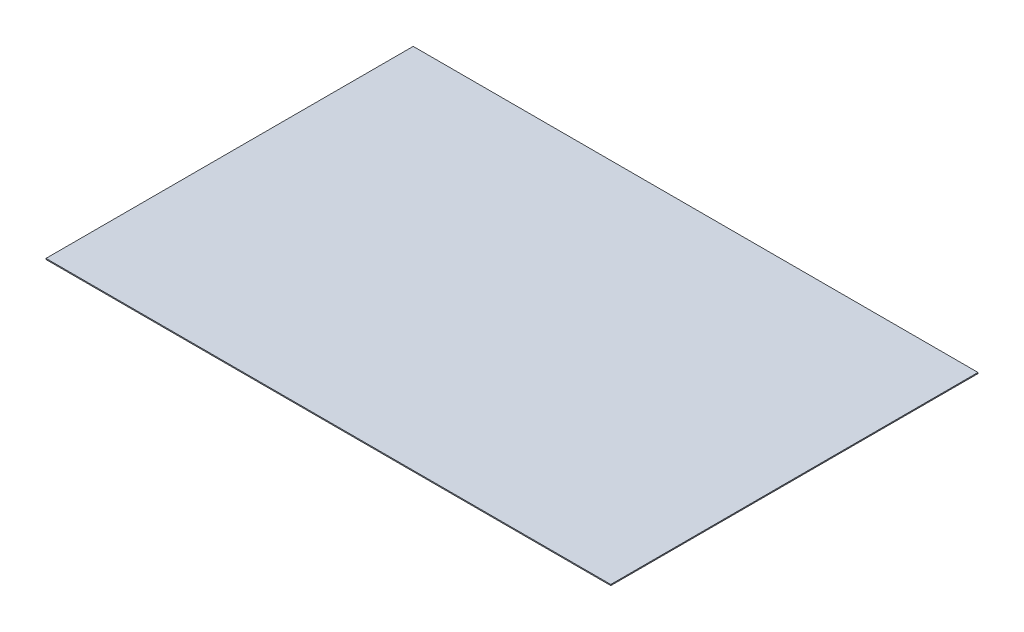
ISO-10303-21;
HEADER;
FILE_DESCRIPTION(('STEP AP214'),'2;1');
FILE_NAME('part.step','',(''),(''),'','','');
FILE_SCHEMA(('AUTOMOTIVE_DESIGN { 1 0 10303 214 1 1 1 1 }'));
ENDSEC;
DATA;
#1=APPLICATION_CONTEXT('core data for automotive mechanical design processes');
#2=APPLICATION_PROTOCOL_DEFINITION('international standard','automotive_design',2000,#1);
#3=PRODUCT_CONTEXT('',#1,'mechanical');
#4=PRODUCT('Part','Part','',(#3));
#5=PRODUCT_RELATED_PRODUCT_CATEGORY('part','',(#4));
#6=PRODUCT_DEFINITION_FORMATION('','',#4);
#7=PRODUCT_DEFINITION_CONTEXT('part definition',#1,'design');
#8=PRODUCT_DEFINITION('design','',#6,#7);
#9=PRODUCT_DEFINITION_SHAPE('','',#8);
#10=(LENGTH_UNIT() NAMED_UNIT(*) SI_UNIT(.MILLI.,.METRE.));
#11=(NAMED_UNIT(*) PLANE_ANGLE_UNIT() SI_UNIT($,.RADIAN.));
#12=(NAMED_UNIT(*) SI_UNIT($,.STERADIAN.) SOLID_ANGLE_UNIT());
#13=UNCERTAINTY_MEASURE_WITH_UNIT(LENGTH_MEASURE(1.E-05),#10,'distance_accuracy_value','');
#14=(GEOMETRIC_REPRESENTATION_CONTEXT(3) GLOBAL_UNCERTAINTY_ASSIGNED_CONTEXT((#13)) GLOBAL_UNIT_ASSIGNED_CONTEXT((#10,
#11,#12)) REPRESENTATION_CONTEXT('',''));
#15=CARTESIAN_POINT('',(0.,0.,0.));
#16=DIRECTION('',(0.,0.,1.));
#17=DIRECTION('',(1.,0.,0.));
#18=AXIS2_PLACEMENT_3D('',#15,#16,#17);
#19=CARTESIAN_POINT('',(468.689888187922,2.,204.733904573833));
#20=DIRECTION('',(-1.,0.,0.));
#21=DIRECTION('',(0.,0.,1.));
#22=AXIS2_PLACEMENT_3D('',#19,#20,#21);
#23=PLANE('',#22);
#24=DIRECTION('',(0.,0.,-1.));
#25=VECTOR('',#24,1.);
#26=CARTESIAN_POINT('',(468.689888187922,0.,204.733904573833));
#27=LINE('',#26,#25);
#28=CARTESIAN_POINT('',(468.689888187922,0.,204.733904573833));
#29=VERTEX_POINT('',#28);
#30=CARTESIAN_POINT('',(468.689888187922,0.,-503.266095426167));
#31=VERTEX_POINT('',#30);
#32=EDGE_CURVE('E96',#29,#31,#27,.T.);
#33=ORIENTED_EDGE('',*,*,#32,.T.);
#34=DIRECTION('',(0.,-1.,0.));
#35=VECTOR('',#34,1.);
#36=CARTESIAN_POINT('',(468.689888187922,2.,-503.266095426167));
#37=LINE('',#36,#35);
#38=CARTESIAN_POINT('',(468.689888187922,2.,-503.266095426167));
#39=VERTEX_POINT('',#38);
#40=EDGE_CURVE('E11',#39,#31,#37,.T.);
#41=ORIENTED_EDGE('',*,*,#40,.F.);
#42=DIRECTION('',(0.,0.,-1.));
#43=VECTOR('',#42,1.);
#44=CARTESIAN_POINT('',(468.689888187922,2.,204.733904573833));
#45=LINE('',#44,#43);
#46=CARTESIAN_POINT('',(468.689888187922,2.,204.733904573833));
#47=VERTEX_POINT('',#46);
#48=EDGE_CURVE('E84',#47,#39,#45,.T.);
#49=ORIENTED_EDGE('',*,*,#48,.F.);
#50=DIRECTION('',(0.,-1.,0.));
#51=VECTOR('',#50,1.);
#52=CARTESIAN_POINT('',(468.689888187922,2.,204.733904573833));
#53=LINE('',#52,#51);
#54=EDGE_CURVE('E92',#47,#29,#53,.T.);
#55=ORIENTED_EDGE('',*,*,#54,.T.);
#56=EDGE_LOOP('',(#33,#41,#49,#55));
#57=FACE_BOUND('',#56,.T.);
#58=ADVANCED_FACE('F33',(#57),#23,.F.);
#59=CARTESIAN_POINT('',(468.689888187922,2.,-503.266095426167));
#60=DIRECTION('',(0.,0.,1.));
#61=DIRECTION('',(1.,0.,0.));
#62=AXIS2_PLACEMENT_3D('',#59,#60,#61);
#63=PLANE('',#62);
#64=DIRECTION('',(-1.,0.,0.));
#65=VECTOR('',#64,1.);
#66=CARTESIAN_POINT('',(468.689888187922,0.,-503.266095426167));
#67=LINE('',#66,#65);
#68=CARTESIAN_POINT('',(-620.310111812077,0.,-503.266095426167));
#69=VERTEX_POINT('',#68);
#70=EDGE_CURVE('E88',#31,#69,#67,.T.);
#71=ORIENTED_EDGE('',*,*,#70,.T.);
#72=DIRECTION('',(0.,-1.,0.));
#73=VECTOR('',#72,1.);
#74=CARTESIAN_POINT('',(-620.310111812077,2.,-503.266095426167));
#75=LINE('',#74,#73);
#76=CARTESIAN_POINT('',(-620.310111812077,2.,-503.266095426167));
#77=VERTEX_POINT('',#76);
#78=EDGE_CURVE('E41',#77,#69,#75,.T.);
#79=ORIENTED_EDGE('',*,*,#78,.F.);
#80=DIRECTION('',(-1.,0.,0.));
#81=VECTOR('',#80,1.);
#82=CARTESIAN_POINT('',(468.689888187922,2.,-503.266095426167));
#83=LINE('',#82,#81);
#84=EDGE_CURVE('E79',#39,#77,#83,.T.);
#85=ORIENTED_EDGE('',*,*,#84,.F.);
#86=ORIENTED_EDGE('',*,*,#40,.T.);
#87=EDGE_LOOP('',(#71,#79,#85,#86));
#88=FACE_BOUND('',#87,.T.);
#89=ADVANCED_FACE('F87',(#88),#63,.F.);
#90=CARTESIAN_POINT('',(-620.310111812077,2.,204.733904573833));
#91=DIRECTION('',(1.,0.,0.));
#92=DIRECTION('',(0.,0.,-1.));
#93=AXIS2_PLACEMENT_3D('',#90,#91,#92);
#94=PLANE('',#93);
#95=DIRECTION('',(0.,0.,1.));
#96=VECTOR('',#95,1.);
#97=CARTESIAN_POINT('',(-620.310111812077,0.,204.733904573833));
#98=LINE('',#97,#96);
#99=CARTESIAN_POINT('',(-620.310111812077,0.,204.733904573833));
#100=VERTEX_POINT('',#99);
#101=EDGE_CURVE('E66',#69,#100,#98,.T.);
#102=ORIENTED_EDGE('',*,*,#101,.T.);
#103=DIRECTION('',(0.,-1.,0.));
#104=VECTOR('',#103,1.);
#105=CARTESIAN_POINT('',(-620.310111812077,2.,204.733904573833));
#106=LINE('',#105,#104);
#107=CARTESIAN_POINT('',(-620.310111812077,2.,204.733904573833));
#108=VERTEX_POINT('',#107);
#109=EDGE_CURVE('E89',#108,#100,#106,.T.);
#110=ORIENTED_EDGE('',*,*,#109,.F.);
#111=DIRECTION('',(0.,0.,1.));
#112=VECTOR('',#111,1.);
#113=CARTESIAN_POINT('',(-620.310111812077,2.,204.733904573833));
#114=LINE('',#113,#112);
#115=EDGE_CURVE('E82',#77,#108,#114,.T.);
#116=ORIENTED_EDGE('',*,*,#115,.F.);
#117=ORIENTED_EDGE('',*,*,#78,.T.);
#118=EDGE_LOOP('',(#102,#110,#116,#117));
#119=FACE_BOUND('',#118,.T.);
#120=ADVANCED_FACE('F90',(#119),#94,.F.);
#121=CARTESIAN_POINT('',(468.689888187922,2.,204.733904573833));
#122=DIRECTION('',(0.,0.,-1.));
#123=DIRECTION('',(-1.,0.,0.));
#124=AXIS2_PLACEMENT_3D('',#121,#122,#123);
#125=PLANE('',#124);
#126=DIRECTION('',(1.,0.,0.));
#127=VECTOR('',#126,1.);
#128=CARTESIAN_POINT('',(468.689888187922,0.,204.733904573833));
#129=LINE('',#128,#127);
#130=EDGE_CURVE('E72',#100,#29,#129,.T.);
#131=ORIENTED_EDGE('',*,*,#130,.T.);
#132=ORIENTED_EDGE('',*,*,#54,.F.);
#133=DIRECTION('',(1.,0.,0.));
#134=VECTOR('',#133,1.);
#135=CARTESIAN_POINT('',(468.689888187922,2.,204.733904573833));
#136=LINE('',#135,#134);
#137=EDGE_CURVE('E49',#108,#47,#136,.T.);
#138=ORIENTED_EDGE('',*,*,#137,.F.);
#139=ORIENTED_EDGE('',*,*,#109,.T.);
#140=EDGE_LOOP('',(#131,#132,#138,#139));
#141=FACE_BOUND('',#140,.T.);
#142=ADVANCED_FACE('F103',(#141),#125,.F.);
#143=CARTESIAN_POINT('',(0.,2.,0.));
#144=DIRECTION('',(0.,1.,0.));
#145=DIRECTION('',(0.,0.,1.));
#146=AXIS2_PLACEMENT_3D('',#143,#144,#145);
#147=PLANE('',#146);
#148=ORIENTED_EDGE('',*,*,#48,.T.);
#149=ORIENTED_EDGE('',*,*,#84,.T.);
#150=ORIENTED_EDGE('',*,*,#115,.T.);
#151=ORIENTED_EDGE('',*,*,#137,.T.);
#152=EDGE_LOOP('',(#148,#149,#150,#151));
#153=FACE_BOUND('',#152,.T.);
#154=ADVANCED_FACE('F80',(#153),#147,.T.);
#155=CARTESIAN_POINT('',(0.,0.,0.));
#156=DIRECTION('',(0.,1.,0.));
#157=DIRECTION('',(0.,0.,1.));
#158=AXIS2_PLACEMENT_3D('',#155,#156,#157);
#159=PLANE('',#158);
#160=ORIENTED_EDGE('',*,*,#32,.F.);
#161=ORIENTED_EDGE('',*,*,#130,.F.);
#162=ORIENTED_EDGE('',*,*,#101,.F.);
#163=ORIENTED_EDGE('',*,*,#70,.F.);
#164=EDGE_LOOP('',(#160,#161,#162,#163));
#165=FACE_BOUND('',#164,.T.);
#166=ADVANCED_FACE('F106',(#165),#159,.F.);
#167=CLOSED_SHELL('',(#58,#89,#120,#142,#154,#166));
#168=MANIFOLD_SOLID_BREP('B2',#167);
#169=ADVANCED_BREP_SHAPE_REPRESENTATION('',(#18,#168),#14);
#170=SHAPE_DEFINITION_REPRESENTATION(#9,#169);
ENDSEC;
END-ISO-10303-21;
